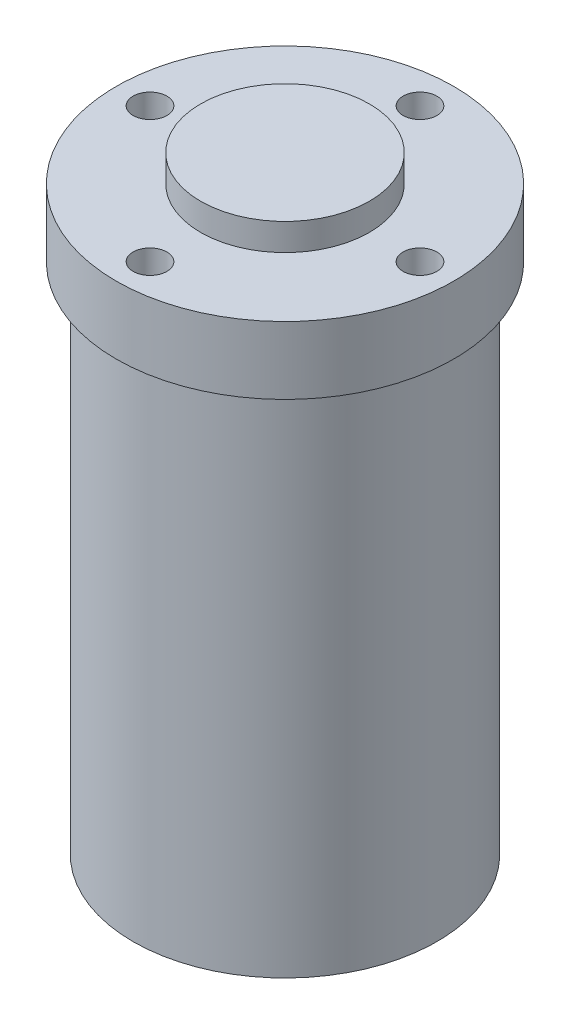
ISO-10303-21;
HEADER;
FILE_DESCRIPTION(('STEP AP214'),'2;1');
FILE_NAME('part.step','',(''),(''),'','','');
FILE_SCHEMA(('AUTOMOTIVE_DESIGN { 1 0 10303 214 1 1 1 1 }'));
ENDSEC;
DATA;
#1=APPLICATION_CONTEXT('core data for automotive mechanical design processes');
#2=APPLICATION_PROTOCOL_DEFINITION('international standard','automotive_design',2000,#1);
#3=PRODUCT_CONTEXT('',#1,'mechanical');
#4=PRODUCT('Part','Part','',(#3));
#5=PRODUCT_RELATED_PRODUCT_CATEGORY('part','',(#4));
#6=PRODUCT_DEFINITION_FORMATION('','',#4);
#7=PRODUCT_DEFINITION_CONTEXT('part definition',#1,'design');
#8=PRODUCT_DEFINITION('design','',#6,#7);
#9=PRODUCT_DEFINITION_SHAPE('','',#8);
#10=(LENGTH_UNIT() NAMED_UNIT(*) SI_UNIT(.MILLI.,.METRE.));
#11=(NAMED_UNIT(*) PLANE_ANGLE_UNIT() SI_UNIT($,.RADIAN.));
#12=(NAMED_UNIT(*) SI_UNIT($,.STERADIAN.) SOLID_ANGLE_UNIT());
#13=UNCERTAINTY_MEASURE_WITH_UNIT(LENGTH_MEASURE(1.E-05),#10,'distance_accuracy_value','');
#14=(GEOMETRIC_REPRESENTATION_CONTEXT(3) GLOBAL_UNCERTAINTY_ASSIGNED_CONTEXT((#13)) GLOBAL_UNIT_ASSIGNED_CONTEXT((#10,
#11,#12)) REPRESENTATION_CONTEXT('',''));
#15=CARTESIAN_POINT('',(0.,0.,0.));
#16=DIRECTION('',(0.,0.,1.));
#17=DIRECTION('',(1.,0.,0.));
#18=AXIS2_PLACEMENT_3D('',#15,#16,#17);
#19=CARTESIAN_POINT('',(0.,76.,0.));
#20=DIRECTION('',(0.,-1.,0.));
#21=DIRECTION('',(0.,0.,-1.));
#22=AXIS2_PLACEMENT_3D('',#19,#20,#21);
#23=CYLINDRICAL_SURFACE('',#22,22.5);
#24=CARTESIAN_POINT('',(0.,76.,0.));
#25=DIRECTION('',(0.,1.,0.));
#26=DIRECTION('',(0.,0.,1.));
#27=AXIS2_PLACEMENT_3D('',#24,#25,#26);
#28=CIRCLE('',#27,22.5);
#29=CARTESIAN_POINT('',(0.,76.,22.5));
#30=VERTEX_POINT('',#29);
#31=EDGE_CURVE('E44',#30,#30,#28,.T.);
#32=ORIENTED_EDGE('',*,*,#31,.F.);
#33=EDGE_LOOP('',(#32));
#34=FACE_BOUND('',#33,.T.);
#35=CARTESIAN_POINT('',(0.,0.,0.));
#36=DIRECTION('',(0.,1.,0.));
#37=DIRECTION('',(0.,0.,1.));
#38=AXIS2_PLACEMENT_3D('',#35,#36,#37);
#39=CIRCLE('',#38,22.5);
#40=CARTESIAN_POINT('',(0.,0.,22.5));
#41=VERTEX_POINT('',#40);
#42=EDGE_CURVE('E40',#41,#41,#39,.T.);
#43=ORIENTED_EDGE('',*,*,#42,.T.);
#44=EDGE_LOOP('',(#43));
#45=FACE_BOUND('',#44,.T.);
#46=ADVANCED_FACE('F37',(#34,#45),#23,.T.);
#47=CARTESIAN_POINT('',(0.,0.,0.));
#48=DIRECTION('',(0.,1.,0.));
#49=DIRECTION('',(0.,0.,1.));
#50=AXIS2_PLACEMENT_3D('',#47,#48,#49);
#51=PLANE('',#50);
#52=CARTESIAN_POINT('',(16.6434890351652,0.,5.40779740156153));
#53=DIRECTION('',(0.,-1.,0.));
#54=DIRECTION('',(-0.951056516295155,0.,-0.309016994374945));
#55=AXIS2_PLACEMENT_3D('',#52,#53,#54);
#56=CIRCLE('',#55,2.5);
#57=CARTESIAN_POINT('',(14.2658477444273,0.,4.63525491562417));
#58=VERTEX_POINT('',#57);
#59=EDGE_CURVE('E114',#58,#58,#56,.T.);
#60=ORIENTED_EDGE('',*,*,#59,.F.);
#61=EDGE_LOOP('',(#60));
#62=FACE_BOUND('',#61,.T.);
#63=CARTESIAN_POINT('',(10.2862419151182,0.,-14.1577974015616));
#64=DIRECTION('',(0.,-1.,0.));
#65=DIRECTION('',(-0.587785252292469,0.,0.809016994374951));
#66=AXIS2_PLACEMENT_3D('',#63,#64,#65);
#67=CIRCLE('',#66,2.5);
#68=CARTESIAN_POINT('',(8.81677878438703,0.,-12.1352549156243));
#69=VERTEX_POINT('',#68);
#70=EDGE_CURVE('E108',#69,#69,#67,.T.);
#71=ORIENTED_EDGE('',*,*,#70,.F.);
#72=EDGE_LOOP('',(#71));
#73=FACE_BOUND('',#72,.T.);
#74=CARTESIAN_POINT('',(-10.2862419151184,0.,-14.1577974015615));
#75=DIRECTION('',(0.,-1.,0.));
#76=DIRECTION('',(0.58778525229248,0.,0.809016994374942));
#77=AXIS2_PLACEMENT_3D('',#74,#75,#76);
#78=CIRCLE('',#77,2.5);
#79=CARTESIAN_POINT('',(-8.8167787843872,0.,-12.1352549156241));
#80=VERTEX_POINT('',#79);
#81=EDGE_CURVE('E102',#80,#80,#78,.T.);
#82=ORIENTED_EDGE('',*,*,#81,.F.);
#83=EDGE_LOOP('',(#82));
#84=FACE_BOUND('',#83,.T.);
#85=CARTESIAN_POINT('',(-16.6434890351651,0.,5.40779740156177));
#86=DIRECTION('',(0.,-1.,0.));
#87=DIRECTION('',(0.95105651629515,0.,-0.309016994374958));
#88=AXIS2_PLACEMENT_3D('',#85,#86,#87);
#89=CIRCLE('',#88,2.5);
#90=CARTESIAN_POINT('',(-14.2658477444273,0.,4.63525491562437));
#91=VERTEX_POINT('',#90);
#92=EDGE_CURVE('E96',#91,#91,#89,.T.);
#93=ORIENTED_EDGE('',*,*,#92,.F.);
#94=EDGE_LOOP('',(#93));
#95=FACE_BOUND('',#94,.T.);
#96=CARTESIAN_POINT('',(0.,0.,17.5));
#97=DIRECTION('',(0.,-1.,0.));
#98=DIRECTION('',(0.,0.,-1.));
#99=AXIS2_PLACEMENT_3D('',#96,#97,#98);
#100=CIRCLE('',#99,2.5);
#101=CARTESIAN_POINT('',(0.,0.,15.));
#102=VERTEX_POINT('',#101);
#103=EDGE_CURVE('E90',#102,#102,#100,.T.);
#104=ORIENTED_EDGE('',*,*,#103,.F.);
#105=EDGE_LOOP('',(#104));
#106=FACE_BOUND('',#105,.T.);
#107=ORIENTED_EDGE('',*,*,#42,.F.);
#108=EDGE_LOOP('',(#107));
#109=FACE_BOUND('',#108,.T.);
#110=ADVANCED_FACE('F129',(#62,#73,#84,#95,#106,#109),#51,.F.);
#111=CARTESIAN_POINT('',(0.,86.,0.));
#112=DIRECTION('',(0.,-1.,0.));
#113=DIRECTION('',(0.,0.,-1.));
#114=AXIS2_PLACEMENT_3D('',#111,#112,#113);
#115=CYLINDRICAL_SURFACE('',#114,25.);
#116=CARTESIAN_POINT('',(0.,86.,0.));
#117=DIRECTION('',(0.,1.,0.));
#118=DIRECTION('',(0.,0.,1.));
#119=AXIS2_PLACEMENT_3D('',#116,#117,#118);
#120=CIRCLE('',#119,25.);
#121=CARTESIAN_POINT('',(0.,86.,25.));
#122=VERTEX_POINT('',#121);
#123=EDGE_CURVE('E53',#122,#122,#120,.T.);
#124=ORIENTED_EDGE('',*,*,#123,.F.);
#125=EDGE_LOOP('',(#124));
#126=FACE_BOUND('',#125,.T.);
#127=CARTESIAN_POINT('',(0.,76.,0.));
#128=DIRECTION('',(0.,1.,0.));
#129=DIRECTION('',(0.,0.,1.));
#130=AXIS2_PLACEMENT_3D('',#127,#128,#129);
#131=CIRCLE('',#130,25.);
#132=CARTESIAN_POINT('',(0.,76.,25.));
#133=VERTEX_POINT('',#132);
#134=EDGE_CURVE('E56',#133,#133,#131,.T.);
#135=ORIENTED_EDGE('',*,*,#134,.T.);
#136=EDGE_LOOP('',(#135));
#137=FACE_BOUND('',#136,.T.);
#138=ADVANCED_FACE('F132',(#126,#137),#115,.T.);
#139=CARTESIAN_POINT('',(0.,86.,0.));
#140=DIRECTION('',(0.,1.,0.));
#141=DIRECTION('',(0.,0.,1.));
#142=AXIS2_PLACEMENT_3D('',#139,#140,#141);
#143=PLANE('',#142);
#144=CARTESIAN_POINT('',(0.,86.,20.));
#145=DIRECTION('',(0.,1.,0.));
#146=DIRECTION('',(1.,0.,0.));
#147=AXIS2_PLACEMENT_3D('',#144,#145,#146);
#148=CIRCLE('',#147,2.5);
#149=CARTESIAN_POINT('',(2.50000000000007,86.,20.));
#150=VERTEX_POINT('',#149);
#151=EDGE_CURVE('E85',#150,#150,#148,.T.);
#152=ORIENTED_EDGE('',*,*,#151,.F.);
#153=EDGE_LOOP('',(#152));
#154=FACE_BOUND('',#153,.T.);
#155=CARTESIAN_POINT('',(20.,86.,0.));
#156=DIRECTION('',(0.,1.,0.));
#157=DIRECTION('',(0.,0.,-1.));
#158=AXIS2_PLACEMENT_3D('',#155,#156,#157);
#159=CIRCLE('',#158,2.5);
#160=CARTESIAN_POINT('',(20.,86.,-2.5));
#161=VERTEX_POINT('',#160);
#162=EDGE_CURVE('E79',#161,#161,#159,.T.);
#163=ORIENTED_EDGE('',*,*,#162,.F.);
#164=EDGE_LOOP('',(#163));
#165=FACE_BOUND('',#164,.T.);
#166=CARTESIAN_POINT('',(-2.09488880330588E-13,86.,-20.));
#167=DIRECTION('',(0.,1.,0.));
#168=DIRECTION('',(-1.,0.,0.));
#169=AXIS2_PLACEMENT_3D('',#166,#167,#168);
#170=CIRCLE('',#169,2.5);
#171=CARTESIAN_POINT('',(-2.50000000000021,86.,-20.));
#172=VERTEX_POINT('',#171);
#173=EDGE_CURVE('E72',#172,#172,#170,.T.);
#174=ORIENTED_EDGE('',*,*,#173,.F.);
#175=EDGE_LOOP('',(#174));
#176=FACE_BOUND('',#175,.T.);
#177=CARTESIAN_POINT('',(-20.,86.,0.));
#178=DIRECTION('',(0.,1.,0.));
#179=DIRECTION('',(0.,0.,1.));
#180=AXIS2_PLACEMENT_3D('',#177,#178,#179);
#181=CIRCLE('',#180,2.5);
#182=CARTESIAN_POINT('',(-20.,86.,2.5));
#183=VERTEX_POINT('',#182);
#184=EDGE_CURVE('E65',#183,#183,#181,.T.);
#185=ORIENTED_EDGE('',*,*,#184,.F.);
#186=EDGE_LOOP('',(#185));
#187=FACE_BOUND('',#186,.T.);
#188=CARTESIAN_POINT('',(0.,86.,0.));
#189=DIRECTION('',(0.,1.,0.));
#190=DIRECTION('',(0.,0.,1.));
#191=AXIS2_PLACEMENT_3D('',#188,#189,#190);
#192=CIRCLE('',#191,12.5);
#193=CARTESIAN_POINT('',(0.,86.,12.5));
#194=VERTEX_POINT('',#193);
#195=EDGE_CURVE('E10',#194,#194,#192,.T.);
#196=ORIENTED_EDGE('',*,*,#195,.F.);
#197=EDGE_LOOP('',(#196));
#198=FACE_BOUND('',#197,.T.);
#199=ORIENTED_EDGE('',*,*,#123,.T.);
#200=EDGE_LOOP('',(#199));
#201=FACE_BOUND('',#200,.T.);
#202=ADVANCED_FACE('F155',(#154,#165,#176,#187,#198,#201),#143,.T.);
#203=CARTESIAN_POINT('',(0.,76.,0.));
#204=DIRECTION('',(0.,1.,0.));
#205=DIRECTION('',(0.,0.,1.));
#206=AXIS2_PLACEMENT_3D('',#203,#204,#205);
#207=PLANE('',#206);
#208=ORIENTED_EDGE('',*,*,#31,.T.);
#209=EDGE_LOOP('',(#208));
#210=FACE_BOUND('',#209,.T.);
#211=ORIENTED_EDGE('',*,*,#134,.F.);
#212=EDGE_LOOP('',(#211));
#213=FACE_BOUND('',#212,.T.);
#214=ADVANCED_FACE('F151',(#210,#213),#207,.F.);
#215=CARTESIAN_POINT('',(0.,90.,0.));
#216=DIRECTION('',(0.,-1.,0.));
#217=DIRECTION('',(0.,0.,-1.));
#218=AXIS2_PLACEMENT_3D('',#215,#216,#217);
#219=CYLINDRICAL_SURFACE('',#218,12.5);
#220=CARTESIAN_POINT('',(0.,90.,0.));
#221=DIRECTION('',(0.,1.,0.));
#222=DIRECTION('',(0.,0.,1.));
#223=AXIS2_PLACEMENT_3D('',#220,#221,#222);
#224=CIRCLE('',#223,12.5);
#225=CARTESIAN_POINT('',(0.,90.,12.5));
#226=VERTEX_POINT('',#225);
#227=EDGE_CURVE('E51',#226,#226,#224,.T.);
#228=ORIENTED_EDGE('',*,*,#227,.F.);
#229=EDGE_LOOP('',(#228));
#230=FACE_BOUND('',#229,.T.);
#231=ORIENTED_EDGE('',*,*,#195,.T.);
#232=EDGE_LOOP('',(#231));
#233=FACE_BOUND('',#232,.T.);
#234=ADVANCED_FACE('F154',(#230,#233),#219,.T.);
#235=CARTESIAN_POINT('',(0.,90.,0.));
#236=DIRECTION('',(0.,1.,0.));
#237=DIRECTION('',(0.,0.,1.));
#238=AXIS2_PLACEMENT_3D('',#235,#236,#237);
#239=PLANE('',#238);
#240=ORIENTED_EDGE('',*,*,#227,.T.);
#241=EDGE_LOOP('',(#240));
#242=FACE_BOUND('',#241,.T.);
#243=ADVANCED_FACE('F160',(#242),#239,.T.);
#244=CARTESIAN_POINT('',(-20.,78.,0.));
#245=DIRECTION('',(0.,1.,0.));
#246=DIRECTION('',(0.,0.,1.));
#247=AXIS2_PLACEMENT_3D('',#244,#245,#246);
#248=CYLINDRICAL_SURFACE('',#247,2.5);
#249=CARTESIAN_POINT('',(-20.,78.,0.));
#250=DIRECTION('',(0.,1.,0.));
#251=DIRECTION('',(0.,0.,1.));
#252=AXIS2_PLACEMENT_3D('',#249,#250,#251);
#253=CIRCLE('',#252,2.5);
#254=CARTESIAN_POINT('',(-20.,78.,2.5));
#255=VERTEX_POINT('',#254);
#256=EDGE_CURVE('E61',#255,#255,#253,.T.);
#257=ORIENTED_EDGE('',*,*,#256,.F.);
#258=EDGE_LOOP('',(#257));
#259=FACE_BOUND('',#258,.T.);
#260=ORIENTED_EDGE('',*,*,#184,.T.);
#261=EDGE_LOOP('',(#260));
#262=FACE_BOUND('',#261,.T.);
#263=ADVANCED_FACE('F194',(#259,#262),#248,.F.);
#264=CARTESIAN_POINT('',(-20.,78.,0.));
#265=DIRECTION('',(0.,1.,0.));
#266=DIRECTION('',(0.,0.,1.));
#267=AXIS2_PLACEMENT_3D('',#264,#265,#266);
#268=PLANE('',#267);
#269=ORIENTED_EDGE('',*,*,#256,.T.);
#270=EDGE_LOOP('',(#269));
#271=FACE_BOUND('',#270,.T.);
#272=ADVANCED_FACE('F201',(#271),#268,.T.);
#273=CARTESIAN_POINT('',(-2.09488880330588E-13,78.,-20.));
#274=DIRECTION('',(0.,1.,0.));
#275=DIRECTION('',(0.,0.,1.));
#276=AXIS2_PLACEMENT_3D('',#273,#274,#275);
#277=CYLINDRICAL_SURFACE('',#276,2.5);
#278=CARTESIAN_POINT('',(-2.09488880330588E-13,78.,-20.));
#279=DIRECTION('',(0.,1.,0.));
#280=DIRECTION('',(-1.,0.,0.));
#281=AXIS2_PLACEMENT_3D('',#278,#279,#280);
#282=CIRCLE('',#281,2.5);
#283=CARTESIAN_POINT('',(-2.50000000000021,78.,-20.));
#284=VERTEX_POINT('',#283);
#285=EDGE_CURVE('E75',#284,#284,#282,.T.);
#286=ORIENTED_EDGE('',*,*,#285,.F.);
#287=EDGE_LOOP('',(#286));
#288=FACE_BOUND('',#287,.T.);
#289=ORIENTED_EDGE('',*,*,#173,.T.);
#290=EDGE_LOOP('',(#289));
#291=FACE_BOUND('',#290,.T.);
#292=ADVANCED_FACE('F208',(#288,#291),#277,.F.);
#293=CARTESIAN_POINT('',(-2.09488880330588E-13,78.,-20.));
#294=DIRECTION('',(0.,1.,0.));
#295=DIRECTION('',(-1.,0.,0.));
#296=AXIS2_PLACEMENT_3D('',#293,#294,#295);
#297=PLANE('',#296);
#298=ORIENTED_EDGE('',*,*,#285,.T.);
#299=EDGE_LOOP('',(#298));
#300=FACE_BOUND('',#299,.T.);
#301=ADVANCED_FACE('F214',(#300),#297,.T.);
#302=CARTESIAN_POINT('',(20.,78.,0.));
#303=DIRECTION('',(0.,1.,0.));
#304=DIRECTION('',(0.,0.,1.));
#305=AXIS2_PLACEMENT_3D('',#302,#303,#304);
#306=CYLINDRICAL_SURFACE('',#305,2.5);
#307=CARTESIAN_POINT('',(20.,78.,0.));
#308=DIRECTION('',(0.,1.,0.));
#309=DIRECTION('',(0.,0.,-1.));
#310=AXIS2_PLACEMENT_3D('',#307,#308,#309);
#311=CIRCLE('',#310,2.5);
#312=CARTESIAN_POINT('',(20.,78.,-2.5));
#313=VERTEX_POINT('',#312);
#314=EDGE_CURVE('E82',#313,#313,#311,.T.);
#315=ORIENTED_EDGE('',*,*,#314,.F.);
#316=EDGE_LOOP('',(#315));
#317=FACE_BOUND('',#316,.T.);
#318=ORIENTED_EDGE('',*,*,#162,.T.);
#319=EDGE_LOOP('',(#318));
#320=FACE_BOUND('',#319,.T.);
#321=ADVANCED_FACE('F222',(#317,#320),#306,.F.);
#322=CARTESIAN_POINT('',(20.,78.,0.));
#323=DIRECTION('',(0.,1.,0.));
#324=DIRECTION('',(0.,0.,-1.));
#325=AXIS2_PLACEMENT_3D('',#322,#323,#324);
#326=PLANE('',#325);
#327=ORIENTED_EDGE('',*,*,#314,.T.);
#328=EDGE_LOOP('',(#327));
#329=FACE_BOUND('',#328,.T.);
#330=ADVANCED_FACE('F230',(#329),#326,.T.);
#331=CARTESIAN_POINT('',(0.,78.,20.));
#332=DIRECTION('',(0.,1.,0.));
#333=DIRECTION('',(0.,0.,1.));
#334=AXIS2_PLACEMENT_3D('',#331,#332,#333);
#335=CYLINDRICAL_SURFACE('',#334,2.5);
#336=CARTESIAN_POINT('',(0.,78.,20.));
#337=DIRECTION('',(0.,1.,0.));
#338=DIRECTION('',(1.,0.,0.));
#339=AXIS2_PLACEMENT_3D('',#336,#337,#338);
#340=CIRCLE('',#339,2.5);
#341=CARTESIAN_POINT('',(2.50000000000007,78.,20.));
#342=VERTEX_POINT('',#341);
#343=EDGE_CURVE('E70',#342,#342,#340,.T.);
#344=ORIENTED_EDGE('',*,*,#343,.F.);
#345=EDGE_LOOP('',(#344));
#346=FACE_BOUND('',#345,.T.);
#347=ORIENTED_EDGE('',*,*,#151,.T.);
#348=EDGE_LOOP('',(#347));
#349=FACE_BOUND('',#348,.T.);
#350=ADVANCED_FACE('F238',(#346,#349),#335,.F.);
#351=CARTESIAN_POINT('',(0.,78.,20.));
#352=DIRECTION('',(0.,1.,0.));
#353=DIRECTION('',(1.,0.,0.));
#354=AXIS2_PLACEMENT_3D('',#351,#352,#353);
#355=PLANE('',#354);
#356=ORIENTED_EDGE('',*,*,#343,.T.);
#357=EDGE_LOOP('',(#356));
#358=FACE_BOUND('',#357,.T.);
#359=ADVANCED_FACE('F246',(#358),#355,.T.);
#360=CARTESIAN_POINT('',(0.,8.,17.5));
#361=DIRECTION('',(0.,-1.,0.));
#362=DIRECTION('',(0.,0.,-1.));
#363=AXIS2_PLACEMENT_3D('',#360,#361,#362);
#364=CYLINDRICAL_SURFACE('',#363,2.5);
#365=CARTESIAN_POINT('',(0.,8.,17.5));
#366=DIRECTION('',(0.,-1.,0.));
#367=DIRECTION('',(0.,0.,-1.));
#368=AXIS2_PLACEMENT_3D('',#365,#366,#367);
#369=CIRCLE('',#368,2.5);
#370=CARTESIAN_POINT('',(0.,8.,15.));
#371=VERTEX_POINT('',#370);
#372=EDGE_CURVE('E76',#371,#371,#369,.T.);
#373=ORIENTED_EDGE('',*,*,#372,.F.);
#374=EDGE_LOOP('',(#373));
#375=FACE_BOUND('',#374,.T.);
#376=ORIENTED_EDGE('',*,*,#103,.T.);
#377=EDGE_LOOP('',(#376));
#378=FACE_BOUND('',#377,.T.);
#379=ADVANCED_FACE('F254',(#375,#378),#364,.F.);
#380=CARTESIAN_POINT('',(0.,8.,17.5));
#381=DIRECTION('',(0.,-1.,0.));
#382=DIRECTION('',(0.,0.,-1.));
#383=AXIS2_PLACEMENT_3D('',#380,#381,#382);
#384=PLANE('',#383);
#385=ORIENTED_EDGE('',*,*,#372,.T.);
#386=EDGE_LOOP('',(#385));
#387=FACE_BOUND('',#386,.T.);
#388=ADVANCED_FACE('F262',(#387),#384,.T.);
#389=CARTESIAN_POINT('',(-16.6434890351651,8.,5.40779740156177));
#390=DIRECTION('',(0.,-1.,0.));
#391=DIRECTION('',(0.,0.,-1.));
#392=AXIS2_PLACEMENT_3D('',#389,#390,#391);
#393=CYLINDRICAL_SURFACE('',#392,2.5);
#394=CARTESIAN_POINT('',(-16.6434890351651,8.,5.40779740156177));
#395=DIRECTION('',(0.,-1.,0.));
#396=DIRECTION('',(0.95105651629515,0.,-0.309016994374958));
#397=AXIS2_PLACEMENT_3D('',#394,#395,#396);
#398=CIRCLE('',#397,2.5);
#399=CARTESIAN_POINT('',(-14.2658477444273,8.,4.63525491562437));
#400=VERTEX_POINT('',#399);
#401=EDGE_CURVE('E99',#400,#400,#398,.T.);
#402=ORIENTED_EDGE('',*,*,#401,.F.);
#403=EDGE_LOOP('',(#402));
#404=FACE_BOUND('',#403,.T.);
#405=ORIENTED_EDGE('',*,*,#92,.T.);
#406=EDGE_LOOP('',(#405));
#407=FACE_BOUND('',#406,.T.);
#408=ADVANCED_FACE('F270',(#404,#407),#393,.F.);
#409=CARTESIAN_POINT('',(-16.6434890351651,8.,5.40779740156177));
#410=DIRECTION('',(0.,-1.,0.));
#411=DIRECTION('',(0.95105651629515,0.,-0.309016994374958));
#412=AXIS2_PLACEMENT_3D('',#409,#410,#411);
#413=PLANE('',#412);
#414=ORIENTED_EDGE('',*,*,#401,.T.);
#415=EDGE_LOOP('',(#414));
#416=FACE_BOUND('',#415,.T.);
#417=ADVANCED_FACE('F278',(#416),#413,.T.);
#418=CARTESIAN_POINT('',(-10.2862419151184,8.,-14.1577974015615));
#419=DIRECTION('',(0.,-1.,0.));
#420=DIRECTION('',(0.,0.,-1.));
#421=AXIS2_PLACEMENT_3D('',#418,#419,#420);
#422=CYLINDRICAL_SURFACE('',#421,2.5);
#423=CARTESIAN_POINT('',(-10.2862419151184,8.,-14.1577974015615));
#424=DIRECTION('',(0.,-1.,0.));
#425=DIRECTION('',(0.58778525229248,0.,0.809016994374942));
#426=AXIS2_PLACEMENT_3D('',#423,#424,#425);
#427=CIRCLE('',#426,2.5);
#428=CARTESIAN_POINT('',(-8.8167787843872,8.,-12.1352549156241));
#429=VERTEX_POINT('',#428);
#430=EDGE_CURVE('E105',#429,#429,#427,.T.);
#431=ORIENTED_EDGE('',*,*,#430,.F.);
#432=EDGE_LOOP('',(#431));
#433=FACE_BOUND('',#432,.T.);
#434=ORIENTED_EDGE('',*,*,#81,.T.);
#435=EDGE_LOOP('',(#434));
#436=FACE_BOUND('',#435,.T.);
#437=ADVANCED_FACE('F286',(#433,#436),#422,.F.);
#438=CARTESIAN_POINT('',(-10.2862419151184,8.,-14.1577974015615));
#439=DIRECTION('',(0.,-1.,0.));
#440=DIRECTION('',(0.58778525229248,0.,0.809016994374942));
#441=AXIS2_PLACEMENT_3D('',#438,#439,#440);
#442=PLANE('',#441);
#443=ORIENTED_EDGE('',*,*,#430,.T.);
#444=EDGE_LOOP('',(#443));
#445=FACE_BOUND('',#444,.T.);
#446=ADVANCED_FACE('F294',(#445),#442,.T.);
#447=CARTESIAN_POINT('',(10.2862419151182,8.,-14.1577974015616));
#448=DIRECTION('',(0.,-1.,0.));
#449=DIRECTION('',(0.,0.,-1.));
#450=AXIS2_PLACEMENT_3D('',#447,#448,#449);
#451=CYLINDRICAL_SURFACE('',#450,2.5);
#452=CARTESIAN_POINT('',(10.2862419151182,8.,-14.1577974015616));
#453=DIRECTION('',(0.,-1.,0.));
#454=DIRECTION('',(-0.587785252292469,0.,0.809016994374951));
#455=AXIS2_PLACEMENT_3D('',#452,#453,#454);
#456=CIRCLE('',#455,2.5);
#457=CARTESIAN_POINT('',(8.81677878438703,8.,-12.1352549156243));
#458=VERTEX_POINT('',#457);
#459=EDGE_CURVE('E111',#458,#458,#456,.T.);
#460=ORIENTED_EDGE('',*,*,#459,.F.);
#461=EDGE_LOOP('',(#460));
#462=FACE_BOUND('',#461,.T.);
#463=ORIENTED_EDGE('',*,*,#70,.T.);
#464=EDGE_LOOP('',(#463));
#465=FACE_BOUND('',#464,.T.);
#466=ADVANCED_FACE('F302',(#462,#465),#451,.F.);
#467=CARTESIAN_POINT('',(10.2862419151182,8.,-14.1577974015616));
#468=DIRECTION('',(0.,-1.,0.));
#469=DIRECTION('',(-0.587785252292469,0.,0.809016994374951));
#470=AXIS2_PLACEMENT_3D('',#467,#468,#469);
#471=PLANE('',#470);
#472=ORIENTED_EDGE('',*,*,#459,.T.);
#473=EDGE_LOOP('',(#472));
#474=FACE_BOUND('',#473,.T.);
#475=ADVANCED_FACE('F125',(#474),#471,.T.);
#476=CARTESIAN_POINT('',(16.6434890351652,8.,5.40779740156153));
#477=DIRECTION('',(0.,-1.,0.));
#478=DIRECTION('',(0.,0.,-1.));
#479=AXIS2_PLACEMENT_3D('',#476,#477,#478);
#480=CYLINDRICAL_SURFACE('',#479,2.5);
#481=CARTESIAN_POINT('',(16.6434890351652,8.,5.40779740156153));
#482=DIRECTION('',(0.,-1.,0.));
#483=DIRECTION('',(-0.951056516295155,0.,-0.309016994374945));
#484=AXIS2_PLACEMENT_3D('',#481,#482,#483);
#485=CIRCLE('',#484,2.5);
#486=CARTESIAN_POINT('',(14.2658477444273,8.,4.63525491562417));
#487=VERTEX_POINT('',#486);
#488=EDGE_CURVE('E93',#487,#487,#485,.T.);
#489=ORIENTED_EDGE('',*,*,#488,.F.);
#490=EDGE_LOOP('',(#489));
#491=FACE_BOUND('',#490,.T.);
#492=ORIENTED_EDGE('',*,*,#59,.T.);
#493=EDGE_LOOP('',(#492));
#494=FACE_BOUND('',#493,.T.);
#495=ADVANCED_FACE('F122',(#491,#494),#480,.F.);
#496=CARTESIAN_POINT('',(16.6434890351652,8.,5.40779740156153));
#497=DIRECTION('',(0.,-1.,0.));
#498=DIRECTION('',(-0.951056516295155,0.,-0.309016994374945));
#499=AXIS2_PLACEMENT_3D('',#496,#497,#498);
#500=PLANE('',#499);
#501=ORIENTED_EDGE('',*,*,#488,.T.);
#502=EDGE_LOOP('',(#501));
#503=FACE_BOUND('',#502,.T.);
#504=ADVANCED_FACE('F120',(#503),#500,.T.);
#505=CLOSED_SHELL('',(#46,#110,#138,#202,#214,#234,#243,#263,#272,#292,#301,#321,#330,#350,#359,
#379,#388,#408,#417,#437,#446,#466,#475,#495,#504));
#506=MANIFOLD_SOLID_BREP('B2',#505);
#507=ADVANCED_BREP_SHAPE_REPRESENTATION('',(#18,#506),#14);
#508=SHAPE_DEFINITION_REPRESENTATION(#9,#507);
ENDSEC;
END-ISO-10303-21;
